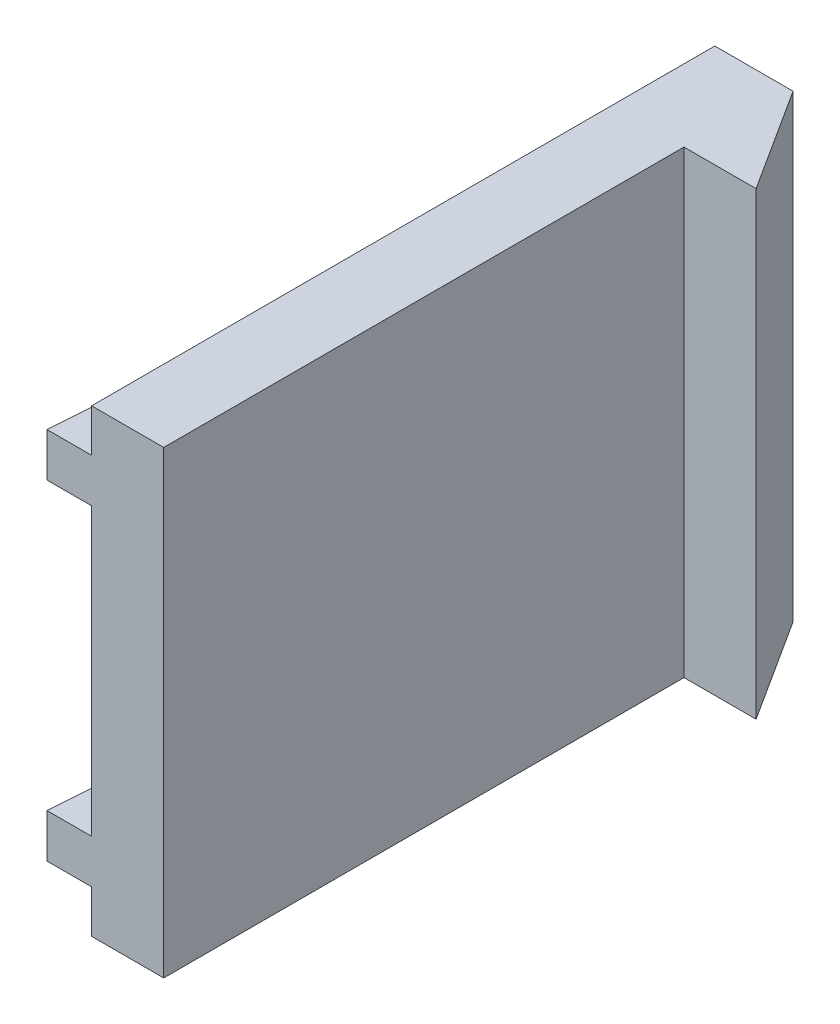
ISO-10303-21;
HEADER;
FILE_DESCRIPTION(('STEP AP214'),'2;1');
FILE_NAME('part.step','',(''),(''),'','','');
FILE_SCHEMA(('AUTOMOTIVE_DESIGN { 1 0 10303 214 1 1 1 1 }'));
ENDSEC;
DATA;
#1=APPLICATION_CONTEXT('core data for automotive mechanical design processes');
#2=APPLICATION_PROTOCOL_DEFINITION('international standard','automotive_design',2000,#1);
#3=PRODUCT_CONTEXT('',#1,'mechanical');
#4=PRODUCT('Part','Part','',(#3));
#5=PRODUCT_RELATED_PRODUCT_CATEGORY('part','',(#4));
#6=PRODUCT_DEFINITION_FORMATION('','',#4);
#7=PRODUCT_DEFINITION_CONTEXT('part definition',#1,'design');
#8=PRODUCT_DEFINITION('design','',#6,#7);
#9=PRODUCT_DEFINITION_SHAPE('','',#8);
#10=(LENGTH_UNIT() NAMED_UNIT(*) SI_UNIT(.MILLI.,.METRE.));
#11=(NAMED_UNIT(*) PLANE_ANGLE_UNIT() SI_UNIT($,.RADIAN.));
#12=(NAMED_UNIT(*) SI_UNIT($,.STERADIAN.) SOLID_ANGLE_UNIT());
#13=UNCERTAINTY_MEASURE_WITH_UNIT(LENGTH_MEASURE(1.E-05),#10,'distance_accuracy_value','');
#14=(GEOMETRIC_REPRESENTATION_CONTEXT(3) GLOBAL_UNCERTAINTY_ASSIGNED_CONTEXT((#13)) GLOBAL_UNIT_ASSIGNED_CONTEXT((#10,
#11,#12)) REPRESENTATION_CONTEXT('',''));
#15=CARTESIAN_POINT('',(0.,0.,0.));
#16=DIRECTION('',(0.,0.,1.));
#17=DIRECTION('',(1.,0.,0.));
#18=AXIS2_PLACEMENT_3D('',#15,#16,#17);
#19=CARTESIAN_POINT('',(91.4159586454189,75.9776670109203,-1.90623561806057));
#20=DIRECTION('',(0.,0.,1.));
#21=DIRECTION('',(0.,-1.,0.));
#22=AXIS2_PLACEMENT_3D('',#19,#20,#21);
#23=PLANE('',#22);
#24=DIRECTION('',(-1.,0.,0.));
#25=VECTOR('',#24,1.);
#26=CARTESIAN_POINT('',(91.2143938482924,76.6085029337508,-1.90623561806057));
#27=LINE('',#26,#25);
#28=CARTESIAN_POINT('',(91.2143938482924,76.6085029337508,-1.90623561806057));
#29=VERTEX_POINT('',#28);
#30=CARTESIAN_POINT('',(90.5566437130537,76.6085029337508,-1.90623561806057));
#31=VERTEX_POINT('',#30);
#32=EDGE_CURVE('E146',#29,#31,#27,.T.);
#33=ORIENTED_EDGE('',*,*,#32,.F.);
#34=DIRECTION('',(0.,1.,0.));
#35=VECTOR('',#34,1.);
#36=CARTESIAN_POINT('',(91.2143938482924,75.9776670109203,-1.90623561806057));
#37=LINE('',#36,#35);
#38=CARTESIAN_POINT('',(91.2143938482924,75.9776670109203,-1.90623561806057));
#39=VERTEX_POINT('',#38);
#40=EDGE_CURVE('E142',#39,#29,#37,.T.);
#41=ORIENTED_EDGE('',*,*,#40,.F.);
#42=DIRECTION('',(-1.,0.,0.));
#43=VECTOR('',#42,1.);
#44=CARTESIAN_POINT('',(92.275273577784,75.9776670109203,-1.90623561806057));
#45=LINE('',#44,#43);
#46=CARTESIAN_POINT('',(92.275273577784,75.9776670109203,-1.90623561806057));
#47=VERTEX_POINT('',#46);
#48=EDGE_CURVE('E192',#47,#39,#45,.T.);
#49=ORIENTED_EDGE('',*,*,#48,.F.);
#50=DIRECTION('',(0.,-1.,0.));
#51=VECTOR('',#50,1.);
#52=CARTESIAN_POINT('',(92.275273577784,82.7391586026916,-1.90623561806057));
#53=LINE('',#52,#51);
#54=CARTESIAN_POINT('',(92.275273577784,82.7391586026916,-1.90623561806057));
#55=VERTEX_POINT('',#54);
#56=EDGE_CURVE('E175',#55,#47,#53,.T.);
#57=ORIENTED_EDGE('',*,*,#56,.F.);
#58=DIRECTION('',(1.,0.,0.));
#59=VECTOR('',#58,1.);
#60=CARTESIAN_POINT('',(91.2143938482924,82.7391586026916,-1.90623561806057));
#61=LINE('',#60,#59);
#62=CARTESIAN_POINT('',(91.2143938482924,82.7391586026916,-1.90623561806057));
#63=VERTEX_POINT('',#62);
#64=EDGE_CURVE('E11',#63,#55,#61,.T.);
#65=ORIENTED_EDGE('',*,*,#64,.F.);
#66=DIRECTION('',(0.,1.,0.));
#67=VECTOR('',#66,1.);
#68=CARTESIAN_POINT('',(91.2143938482924,82.1083226798611,-1.90623561806057));
#69=LINE('',#68,#67);
#70=CARTESIAN_POINT('',(91.2143938482924,82.1083226798611,-1.90623561806057));
#71=VERTEX_POINT('',#70);
#72=EDGE_CURVE('E193',#71,#63,#69,.T.);
#73=ORIENTED_EDGE('',*,*,#72,.F.);
#74=DIRECTION('',(-1.,0.,0.));
#75=VECTOR('',#74,1.);
#76=CARTESIAN_POINT('',(91.2143938482924,82.1083226798611,-1.90623561806057));
#77=LINE('',#76,#75);
#78=CARTESIAN_POINT('',(90.5566437130537,82.1083226798611,-1.90623561806057));
#79=VERTEX_POINT('',#78);
#80=EDGE_CURVE('E167',#71,#79,#77,.T.);
#81=ORIENTED_EDGE('',*,*,#80,.T.);
#82=DIRECTION('',(0.,-1.,0.));
#83=VECTOR('',#82,1.);
#84=CARTESIAN_POINT('',(90.5566437130537,82.1083226798611,-1.90623561806057));
#85=LINE('',#84,#83);
#86=CARTESIAN_POINT('',(90.5566437130537,81.4641056681932,-1.90623561806057));
#87=VERTEX_POINT('',#86);
#88=EDGE_CURVE('E164',#79,#87,#85,.T.);
#89=ORIENTED_EDGE('',*,*,#88,.T.);
#90=DIRECTION('',(1.,0.,0.));
#91=VECTOR('',#90,1.);
#92=CARTESIAN_POINT('',(90.5566437130537,81.4641056681932,-1.90623561806057));
#93=LINE('',#92,#91);
#94=CARTESIAN_POINT('',(91.2143938482924,81.4641056681932,-1.90623561806057));
#95=VERTEX_POINT('',#94);
#96=EDGE_CURVE('E149',#87,#95,#93,.T.);
#97=ORIENTED_EDGE('',*,*,#96,.T.);
#98=DIRECTION('',(0.,1.,0.));
#99=VECTOR('',#98,1.);
#100=CARTESIAN_POINT('',(91.2143938482924,77.2527199454188,-1.90623561806057));
#101=LINE('',#100,#99);
#102=CARTESIAN_POINT('',(91.2143938482924,77.2527199454188,-1.90623561806057));
#103=VERTEX_POINT('',#102);
#104=EDGE_CURVE('E186',#103,#95,#101,.T.);
#105=ORIENTED_EDGE('',*,*,#104,.F.);
#106=DIRECTION('',(1.,0.,0.));
#107=VECTOR('',#106,1.);
#108=CARTESIAN_POINT('',(90.5566437130537,77.2527199454188,-1.90623561806057));
#109=LINE('',#108,#107);
#110=CARTESIAN_POINT('',(90.5566437130537,77.2527199454188,-1.90623561806057));
#111=VERTEX_POINT('',#110);
#112=EDGE_CURVE('E157',#111,#103,#109,.T.);
#113=ORIENTED_EDGE('',*,*,#112,.F.);
#114=DIRECTION('',(0.,1.,0.));
#115=VECTOR('',#114,1.);
#116=CARTESIAN_POINT('',(90.5566437130537,76.6085029337508,-1.90623561806057));
#117=LINE('',#116,#115);
#118=EDGE_CURVE('E152',#31,#111,#117,.T.);
#119=ORIENTED_EDGE('',*,*,#118,.F.);
#120=EDGE_LOOP('',(#33,#41,#49,#57,#65,#73,#81,#89,#97,#105,#113,#119));
#121=FACE_BOUND('',#120,.T.);
#122=ADVANCED_FACE('F41',(#121),#23,.T.);
#123=CARTESIAN_POINT('',(92.3662035338165,79.358412806806,-11.0763790744488));
#124=DIRECTION('',(0.,0.,-1.));
#125=DIRECTION('',(1.,0.,0.));
#126=AXIS2_PLACEMENT_3D('',#123,#124,#125);
#127=PLANE('',#126);
#128=DIRECTION('',(0.,1.,0.));
#129=VECTOR('',#128,1.);
#130=CARTESIAN_POINT('',(91.2143938482924,81.4641056681932,-11.0763790744488));
#131=LINE('',#130,#129);
#132=CARTESIAN_POINT('',(91.2143938482924,81.4641056681932,-11.0763790744488));
#133=VERTEX_POINT('',#132);
#134=CARTESIAN_POINT('',(91.2143938482924,82.1083226798611,-11.0763790744488));
#135=VERTEX_POINT('',#134);
#136=EDGE_CURVE('E161',#133,#135,#131,.T.);
#137=ORIENTED_EDGE('',*,*,#136,.T.);
#138=DIRECTION('',(0.,1.,0.));
#139=VECTOR('',#138,1.);
#140=CARTESIAN_POINT('',(91.2143938482924,82.1083226798611,-11.0763790744488));
#141=LINE('',#140,#139);
#142=CARTESIAN_POINT('',(91.2143938482924,82.7391586026916,-11.0763790744488));
#143=VERTEX_POINT('',#142);
#144=EDGE_CURVE('E191',#135,#143,#141,.T.);
#145=ORIENTED_EDGE('',*,*,#144,.T.);
#146=DIRECTION('',(1.,0.,0.));
#147=VECTOR('',#146,1.);
#148=CARTESIAN_POINT('',(91.2143938482924,82.7391586026916,-11.0763790744488));
#149=LINE('',#148,#147);
#150=CARTESIAN_POINT('',(92.3662035338165,82.7391586026916,-11.0763790744488));
#151=VERTEX_POINT('',#150);
#152=EDGE_CURVE('E51',#143,#151,#149,.T.);
#153=ORIENTED_EDGE('',*,*,#152,.T.);
#154=DIRECTION('',(0.,-1.,0.));
#155=VECTOR('',#154,1.);
#156=CARTESIAN_POINT('',(92.3662035338165,82.7391586026916,-11.0763790744488));
#157=LINE('',#156,#155);
#158=CARTESIAN_POINT('',(92.3662035338165,75.9776670109203,-11.0763790744488));
#159=VERTEX_POINT('',#158);
#160=EDGE_CURVE('E134',#151,#159,#157,.T.);
#161=ORIENTED_EDGE('',*,*,#160,.T.);
#162=DIRECTION('',(-1.,0.,0.));
#163=VECTOR('',#162,1.);
#164=CARTESIAN_POINT('',(92.3662035338165,75.9776670109203,-11.0763790744488));
#165=LINE('',#164,#163);
#166=CARTESIAN_POINT('',(91.2143938482924,75.9776670109203,-11.0763790744488));
#167=VERTEX_POINT('',#166);
#168=EDGE_CURVE('E132',#159,#167,#165,.T.);
#169=ORIENTED_EDGE('',*,*,#168,.T.);
#170=DIRECTION('',(0.,1.,0.));
#171=VECTOR('',#170,1.);
#172=CARTESIAN_POINT('',(91.2143938482924,75.9776670109203,-11.0763790744488));
#173=LINE('',#172,#171);
#174=CARTESIAN_POINT('',(91.2143938482924,76.6085029337508,-11.0763790744488));
#175=VERTEX_POINT('',#174);
#176=EDGE_CURVE('E141',#167,#175,#173,.T.);
#177=ORIENTED_EDGE('',*,*,#176,.T.);
#178=DIRECTION('',(0.,1.,0.));
#179=VECTOR('',#178,1.);
#180=CARTESIAN_POINT('',(91.2143938482924,76.6085029337508,-11.0763790744488));
#181=LINE('',#180,#179);
#182=CARTESIAN_POINT('',(91.2143938482924,77.2527199454188,-11.0763790744488));
#183=VERTEX_POINT('',#182);
#184=EDGE_CURVE('E145',#175,#183,#181,.T.);
#185=ORIENTED_EDGE('',*,*,#184,.T.);
#186=DIRECTION('',(0.,1.,0.));
#187=VECTOR('',#186,1.);
#188=CARTESIAN_POINT('',(91.2143938482924,77.2527199454188,-11.0763790744488));
#189=LINE('',#188,#187);
#190=EDGE_CURVE('E183',#183,#133,#189,.T.);
#191=ORIENTED_EDGE('',*,*,#190,.T.);
#192=EDGE_LOOP('',(#137,#145,#153,#161,#169,#177,#185,#191));
#193=FACE_BOUND('',#192,.T.);
#194=ADVANCED_FACE('F215',(#193),#127,.T.);
#195=CARTESIAN_POINT('',(91.2143938482924,82.7391586026916,-6.49130734625471));
#196=DIRECTION('',(0.,1.,0.));
#197=DIRECTION('',(1.,0.,0.));
#198=AXIS2_PLACEMENT_3D('',#195,#196,#197);
#199=PLANE('',#198);
#200=DIRECTION('',(0.,0.,-1.));
#201=VECTOR('',#200,1.);
#202=CARTESIAN_POINT('',(91.2143938482924,82.7391586026916,-1.90623561806057));
#203=LINE('',#202,#201);
#204=EDGE_CURVE('E59',#63,#143,#203,.T.);
#205=ORIENTED_EDGE('',*,*,#204,.F.);
#206=ORIENTED_EDGE('',*,*,#64,.T.);
#207=DIRECTION('',(0.,0.,-1.));
#208=VECTOR('',#207,1.);
#209=CARTESIAN_POINT('',(92.275273577784,82.7391586026916,-1.90623561806057));
#210=LINE('',#209,#208);
#211=CARTESIAN_POINT('',(92.275273577784,82.7391586026916,-9.56226233944934));
#212=VERTEX_POINT('',#211);
#213=EDGE_CURVE('E170',#55,#212,#210,.T.);
#214=ORIENTED_EDGE('',*,*,#213,.T.);
#215=DIRECTION('',(1.,0.,0.));
#216=VECTOR('',#215,1.);
#217=CARTESIAN_POINT('',(92.275273577784,82.7391586026916,-9.56226233944934));
#218=LINE('',#217,#216);
#219=CARTESIAN_POINT('',(93.3361533072757,82.7391586026916,-9.56226233944934));
#220=VERTEX_POINT('',#219);
#221=EDGE_CURVE('E128',#212,#220,#218,.T.);
#222=ORIENTED_EDGE('',*,*,#221,.T.);
#223=DIRECTION('',(-0.539414664723181,0.,-0.842040271888214));
#224=VECTOR('',#223,1.);
#225=CARTESIAN_POINT('',(93.3361533072757,82.7391586026916,-9.56226233944934));
#226=LINE('',#225,#224);
#227=EDGE_CURVE('E117',#220,#151,#226,.T.);
#228=ORIENTED_EDGE('',*,*,#227,.T.);
#229=ORIENTED_EDGE('',*,*,#152,.F.);
#230=EDGE_LOOP('',(#205,#206,#214,#222,#228,#229));
#231=FACE_BOUND('',#230,.T.);
#232=ADVANCED_FACE('F217',(#231),#199,.T.);
#233=CARTESIAN_POINT('',(93.3361533072757,75.9776670109203,-6.49130734625471));
#234=DIRECTION('',(0.,-1.,0.));
#235=DIRECTION('',(0.,0.,1.));
#236=AXIS2_PLACEMENT_3D('',#233,#234,#235);
#237=PLANE('',#236);
#238=DIRECTION('',(0.,0.,-1.));
#239=VECTOR('',#238,1.);
#240=CARTESIAN_POINT('',(92.275273577784,75.9776670109203,-1.90623561806057));
#241=LINE('',#240,#239);
#242=CARTESIAN_POINT('',(92.275273577784,75.9776670109203,-9.56226233944934));
#243=VERTEX_POINT('',#242);
#244=EDGE_CURVE('E156',#47,#243,#241,.T.);
#245=ORIENTED_EDGE('',*,*,#244,.F.);
#246=ORIENTED_EDGE('',*,*,#48,.T.);
#247=DIRECTION('',(0.,0.,-1.));
#248=VECTOR('',#247,1.);
#249=CARTESIAN_POINT('',(91.2143938482924,75.9776670109203,-1.90623561806057));
#250=LINE('',#249,#248);
#251=EDGE_CURVE('E139',#39,#167,#250,.T.);
#252=ORIENTED_EDGE('',*,*,#251,.T.);
#253=ORIENTED_EDGE('',*,*,#168,.F.);
#254=DIRECTION('',(-0.539414664723181,0.,-0.842040271888214));
#255=VECTOR('',#254,1.);
#256=CARTESIAN_POINT('',(93.3361533072757,75.9776670109203,-9.56226233944934));
#257=LINE('',#256,#255);
#258=CARTESIAN_POINT('',(93.3361533072757,75.9776670109203,-9.56226233944934));
#259=VERTEX_POINT('',#258);
#260=EDGE_CURVE('E115',#259,#159,#257,.T.);
#261=ORIENTED_EDGE('',*,*,#260,.F.);
#262=DIRECTION('',(-1.,0.,0.));
#263=VECTOR('',#262,1.);
#264=CARTESIAN_POINT('',(93.3361533072757,75.9776670109203,-9.56226233944934));
#265=LINE('',#264,#263);
#266=EDGE_CURVE('E121',#259,#243,#265,.T.);
#267=ORIENTED_EDGE('',*,*,#266,.T.);
#268=EDGE_LOOP('',(#245,#246,#252,#253,#261,#267));
#269=FACE_BOUND('',#268,.T.);
#270=ADVANCED_FACE('F130',(#269),#237,.T.);
#271=CARTESIAN_POINT('',(91.2143938482924,79.358412806806,-5.72203909710651));
#272=DIRECTION('',(-1.,0.,0.));
#273=DIRECTION('',(0.,0.,-1.));
#274=AXIS2_PLACEMENT_3D('',#271,#272,#273);
#275=PLANE('',#274);
#276=ORIENTED_EDGE('',*,*,#144,.F.);
#277=DIRECTION('',(0.,0.,1.));
#278=VECTOR('',#277,1.);
#279=CARTESIAN_POINT('',(91.2143938482924,82.1083226798611,-11.0763790744488));
#280=LINE('',#279,#278);
#281=EDGE_CURVE('E168',#135,#71,#280,.T.);
#282=ORIENTED_EDGE('',*,*,#281,.T.);
#283=ORIENTED_EDGE('',*,*,#72,.T.);
#284=ORIENTED_EDGE('',*,*,#204,.T.);
#285=EDGE_LOOP('',(#276,#282,#283,#284));
#286=FACE_BOUND('',#285,.T.);
#287=ADVANCED_FACE('F235',(#286),#275,.T.);
#288=CARTESIAN_POINT('',(91.2143938482924,79.358412806806,-5.72203909710651));
#289=DIRECTION('',(-1.,0.,0.));
#290=DIRECTION('',(0.,0.,-1.));
#291=AXIS2_PLACEMENT_3D('',#288,#289,#290);
#292=PLANE('',#291);
#293=DIRECTION('',(0.,0.,1.));
#294=VECTOR('',#293,1.);
#295=CARTESIAN_POINT('',(91.2143938482924,76.6085029337508,-11.0763790744488));
#296=LINE('',#295,#294);
#297=EDGE_CURVE('E143',#175,#29,#296,.T.);
#298=ORIENTED_EDGE('',*,*,#297,.F.);
#299=ORIENTED_EDGE('',*,*,#176,.F.);
#300=ORIENTED_EDGE('',*,*,#251,.F.);
#301=ORIENTED_EDGE('',*,*,#40,.T.);
#302=EDGE_LOOP('',(#298,#299,#300,#301));
#303=FACE_BOUND('',#302,.T.);
#304=ADVANCED_FACE('F259',(#303),#292,.T.);
#305=CARTESIAN_POINT('',(91.2143938482924,79.358412806806,-5.72203909710651));
#306=DIRECTION('',(-1.,0.,0.));
#307=DIRECTION('',(0.,0.,-1.));
#308=AXIS2_PLACEMENT_3D('',#305,#306,#307);
#309=PLANE('',#308);
#310=ORIENTED_EDGE('',*,*,#104,.T.);
#311=DIRECTION('',(0.,0.,-1.));
#312=VECTOR('',#311,1.);
#313=CARTESIAN_POINT('',(91.2143938482924,81.4641056681932,-1.90623561806057));
#314=LINE('',#313,#312);
#315=EDGE_CURVE('E158',#95,#133,#314,.T.);
#316=ORIENTED_EDGE('',*,*,#315,.T.);
#317=ORIENTED_EDGE('',*,*,#190,.F.);
#318=DIRECTION('',(0.,0.,-1.));
#319=VECTOR('',#318,1.);
#320=CARTESIAN_POINT('',(91.2143938482924,77.2527199454188,-1.90623561806057));
#321=LINE('',#320,#319);
#322=EDGE_CURVE('E153',#103,#183,#321,.T.);
#323=ORIENTED_EDGE('',*,*,#322,.F.);
#324=EDGE_LOOP('',(#310,#316,#317,#323));
#325=FACE_BOUND('',#324,.T.);
#326=ADVANCED_FACE('F287',(#325),#309,.T.);
#327=CARTESIAN_POINT('',(93.3361533072757,75.9776670109203,-9.56226233944934));
#328=DIRECTION('',(0.,0.,1.));
#329=DIRECTION('',(0.,-1.,0.));
#330=AXIS2_PLACEMENT_3D('',#327,#328,#329);
#331=PLANE('',#330);
#332=ORIENTED_EDGE('',*,*,#266,.F.);
#333=DIRECTION('',(0.,-1.,0.));
#334=VECTOR('',#333,1.);
#335=CARTESIAN_POINT('',(93.3361533072757,82.7391586026916,-9.56226233944934));
#336=LINE('',#335,#334);
#337=EDGE_CURVE('E45',#220,#259,#336,.T.);
#338=ORIENTED_EDGE('',*,*,#337,.F.);
#339=ORIENTED_EDGE('',*,*,#221,.F.);
#340=DIRECTION('',(0.,1.,0.));
#341=VECTOR('',#340,1.);
#342=CARTESIAN_POINT('',(92.275273577784,75.9776670109203,-9.56226233944934));
#343=LINE('',#342,#341);
#344=EDGE_CURVE('E125',#243,#212,#343,.T.);
#345=ORIENTED_EDGE('',*,*,#344,.F.);
#346=EDGE_LOOP('',(#332,#338,#339,#345));
#347=FACE_BOUND('',#346,.T.);
#348=ADVANCED_FACE('F124',(#347),#331,.T.);
#349=CARTESIAN_POINT('',(92.8511784205461,82.7391586026916,-10.3193207069491));
#350=DIRECTION('',(0.842040271888205,0.,-0.539414664723196));
#351=DIRECTION('',(0.,-1.,0.));
#352=AXIS2_PLACEMENT_3D('',#349,#350,#351);
#353=PLANE('',#352);
#354=ORIENTED_EDGE('',*,*,#227,.F.);
#355=ORIENTED_EDGE('',*,*,#337,.T.);
#356=ORIENTED_EDGE('',*,*,#260,.T.);
#357=ORIENTED_EDGE('',*,*,#160,.F.);
#358=EDGE_LOOP('',(#354,#355,#356,#357));
#359=FACE_BOUND('',#358,.T.);
#360=ADVANCED_FACE('F112',(#359),#353,.T.);
#361=CARTESIAN_POINT('',(92.2752735777841,79.358412806806,-5.72203909710651));
#362=DIRECTION('',(1.,0.,0.));
#363=DIRECTION('',(0.,1.,0.));
#364=AXIS2_PLACEMENT_3D('',#361,#362,#363);
#365=PLANE('',#364);
#366=ORIENTED_EDGE('',*,*,#244,.T.);
#367=ORIENTED_EDGE('',*,*,#344,.T.);
#368=ORIENTED_EDGE('',*,*,#213,.F.);
#369=ORIENTED_EDGE('',*,*,#56,.T.);
#370=EDGE_LOOP('',(#366,#367,#368,#369));
#371=FACE_BOUND('',#370,.T.);
#372=ADVANCED_FACE('F196',(#371),#365,.T.);
#373=CARTESIAN_POINT('',(91.4159586454189,77.2527199454188,-11.0763790744488));
#374=DIRECTION('',(0.,1.,0.));
#375=DIRECTION('',(1.,0.,0.));
#376=AXIS2_PLACEMENT_3D('',#373,#374,#375);
#377=PLANE('',#376);
#378=ORIENTED_EDGE('',*,*,#112,.T.);
#379=ORIENTED_EDGE('',*,*,#322,.T.);
#380=DIRECTION('',(0.0715435520056016,0.,-0.997437476820689));
#381=VECTOR('',#380,1.);
#382=CARTESIAN_POINT('',(90.5566437130537,77.2527199454188,-1.90623561806057));
#383=LINE('',#382,#381);
#384=EDGE_CURVE('E150',#111,#183,#383,.T.);
#385=ORIENTED_EDGE('',*,*,#384,.F.);
#386=EDGE_LOOP('',(#378,#379,#385));
#387=FACE_BOUND('',#386,.T.);
#388=ADVANCED_FACE('F296',(#387),#377,.T.);
#389=CARTESIAN_POINT('',(90.885518780673,76.6085029337508,-6.49130734625471));
#390=DIRECTION('',(-0.997437476820689,0.,-0.0715435520055997));
#391=DIRECTION('',(0.,1.,0.));
#392=AXIS2_PLACEMENT_3D('',#389,#390,#391);
#393=PLANE('',#392);
#394=DIRECTION('',(0.0715435520056016,0.,-0.997437476820689));
#395=VECTOR('',#394,1.);
#396=CARTESIAN_POINT('',(90.5566437130537,76.6085029337508,-1.90623561806057));
#397=LINE('',#396,#395);
#398=EDGE_CURVE('E147',#31,#175,#397,.T.);
#399=ORIENTED_EDGE('',*,*,#398,.F.);
#400=ORIENTED_EDGE('',*,*,#118,.T.);
#401=ORIENTED_EDGE('',*,*,#384,.T.);
#402=ORIENTED_EDGE('',*,*,#184,.F.);
#403=EDGE_LOOP('',(#399,#400,#401,#402));
#404=FACE_BOUND('',#403,.T.);
#405=ADVANCED_FACE('F253',(#404),#393,.T.);
#406=CARTESIAN_POINT('',(91.4159586454189,76.6085029337508,-11.0763790744488));
#407=DIRECTION('',(0.,-1.,0.));
#408=DIRECTION('',(0.,0.,1.));
#409=AXIS2_PLACEMENT_3D('',#406,#407,#408);
#410=PLANE('',#409);
#411=ORIENTED_EDGE('',*,*,#398,.T.);
#412=ORIENTED_EDGE('',*,*,#297,.T.);
#413=ORIENTED_EDGE('',*,*,#32,.T.);
#414=EDGE_LOOP('',(#411,#412,#413));
#415=FACE_BOUND('',#414,.T.);
#416=ADVANCED_FACE('F257',(#415),#410,.T.);
#417=CARTESIAN_POINT('',(90.885518780673,81.4641056681932,-6.49130734625471));
#418=DIRECTION('',(0.,-1.,0.));
#419=DIRECTION('',(0.,0.,1.));
#420=AXIS2_PLACEMENT_3D('',#417,#418,#419);
#421=PLANE('',#420);
#422=ORIENTED_EDGE('',*,*,#315,.F.);
#423=ORIENTED_EDGE('',*,*,#96,.F.);
#424=DIRECTION('',(0.0715435520056016,0.,-0.997437476820689));
#425=VECTOR('',#424,1.);
#426=CARTESIAN_POINT('',(90.5566437130537,81.4641056681932,-1.90623561806057));
#427=LINE('',#426,#425);
#428=EDGE_CURVE('E162',#87,#133,#427,.T.);
#429=ORIENTED_EDGE('',*,*,#428,.T.);
#430=EDGE_LOOP('',(#422,#423,#429));
#431=FACE_BOUND('',#430,.T.);
#432=ADVANCED_FACE('F271',(#431),#421,.T.);
#433=CARTESIAN_POINT('',(90.5566437130537,81.7862141740271,-1.90623561806057));
#434=DIRECTION('',(-0.997437476820689,0.,-0.0715435520055997));
#435=DIRECTION('',(0.,1.,0.));
#436=AXIS2_PLACEMENT_3D('',#433,#434,#435);
#437=PLANE('',#436);
#438=ORIENTED_EDGE('',*,*,#88,.F.);
#439=DIRECTION('',(0.0715435520056016,0.,-0.997437476820689));
#440=VECTOR('',#439,1.);
#441=CARTESIAN_POINT('',(90.5566437130537,82.1083226798611,-1.90623561806057));
#442=LINE('',#441,#440);
#443=EDGE_CURVE('E165',#79,#135,#442,.T.);
#444=ORIENTED_EDGE('',*,*,#443,.T.);
#445=ORIENTED_EDGE('',*,*,#136,.F.);
#446=ORIENTED_EDGE('',*,*,#428,.F.);
#447=EDGE_LOOP('',(#438,#444,#445,#446));
#448=FACE_BOUND('',#447,.T.);
#449=ADVANCED_FACE('F264',(#448),#437,.T.);
#450=CARTESIAN_POINT('',(91.6175234425454,82.1083226798611,-6.49130734625471));
#451=DIRECTION('',(0.,1.,0.));
#452=DIRECTION('',(1.,0.,0.));
#453=AXIS2_PLACEMENT_3D('',#450,#451,#452);
#454=PLANE('',#453);
#455=ORIENTED_EDGE('',*,*,#281,.F.);
#456=ORIENTED_EDGE('',*,*,#443,.F.);
#457=ORIENTED_EDGE('',*,*,#80,.F.);
#458=EDGE_LOOP('',(#455,#456,#457));
#459=FACE_BOUND('',#458,.T.);
#460=ADVANCED_FACE('F43',(#459),#454,.T.);
#461=CLOSED_SHELL('',(#122,#194,#232,#270,#287,#304,#326,#348,#360,#372,#388,#405,#416,#432,
#449,#460));
#462=MANIFOLD_SOLID_BREP('B2',#461);
#463=ADVANCED_BREP_SHAPE_REPRESENTATION('',(#18,#462),#14);
#464=SHAPE_DEFINITION_REPRESENTATION(#9,#463);
ENDSEC;
END-ISO-10303-21;
